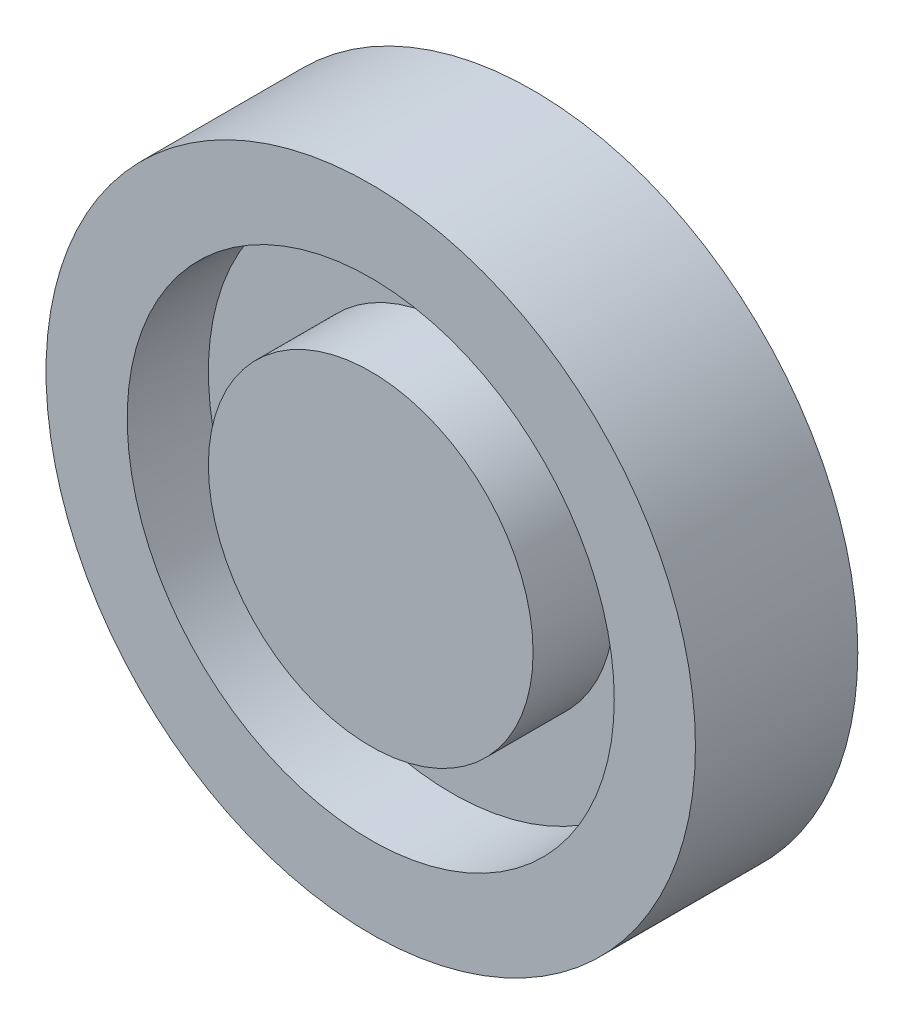
ISO-10303-21;
HEADER;
FILE_DESCRIPTION(('STEP AP214'),'2;1');
FILE_NAME('part.step','',(''),(''),'','','');
FILE_SCHEMA(('AUTOMOTIVE_DESIGN { 1 0 10303 214 1 1 1 1 }'));
ENDSEC;
DATA;
#1=APPLICATION_CONTEXT('core data for automotive mechanical design processes');
#2=APPLICATION_PROTOCOL_DEFINITION('international standard','automotive_design',2000,#1);
#3=PRODUCT_CONTEXT('',#1,'mechanical');
#4=PRODUCT('Part','Part','',(#3));
#5=PRODUCT_RELATED_PRODUCT_CATEGORY('part','',(#4));
#6=PRODUCT_DEFINITION_FORMATION('','',#4);
#7=PRODUCT_DEFINITION_CONTEXT('part definition',#1,'design');
#8=PRODUCT_DEFINITION('design','',#6,#7);
#9=PRODUCT_DEFINITION_SHAPE('','',#8);
#10=(LENGTH_UNIT() NAMED_UNIT(*) SI_UNIT(.MILLI.,.METRE.));
#11=(NAMED_UNIT(*) PLANE_ANGLE_UNIT() SI_UNIT($,.RADIAN.));
#12=(NAMED_UNIT(*) SI_UNIT($,.STERADIAN.) SOLID_ANGLE_UNIT());
#13=UNCERTAINTY_MEASURE_WITH_UNIT(LENGTH_MEASURE(1.E-05),#10,'distance_accuracy_value','');
#14=(GEOMETRIC_REPRESENTATION_CONTEXT(3) GLOBAL_UNCERTAINTY_ASSIGNED_CONTEXT((#13)) GLOBAL_UNIT_ASSIGNED_CONTEXT((#10,
#11,#12)) REPRESENTATION_CONTEXT('',''));
#15=CARTESIAN_POINT('',(0.,0.,0.));
#16=DIRECTION('',(0.,0.,1.));
#17=DIRECTION('',(1.,0.,0.));
#18=AXIS2_PLACEMENT_3D('',#15,#16,#17);
#19=CARTESIAN_POINT('',(0.,0.,1.));
#20=DIRECTION('',(0.,0.,-1.));
#21=DIRECTION('',(-1.,0.,0.));
#22=AXIS2_PLACEMENT_3D('',#19,#20,#21);
#23=CYLINDRICAL_SURFACE('',#22,2.);
#24=CARTESIAN_POINT('',(0.,0.,1.));
#25=DIRECTION('',(0.,0.,1.));
#26=DIRECTION('',(1.,0.,0.));
#27=AXIS2_PLACEMENT_3D('',#24,#25,#26);
#28=CIRCLE('',#27,2.);
#29=CARTESIAN_POINT('',(2.,0.,1.));
#30=VERTEX_POINT('',#29);
#31=EDGE_CURVE('E10',#30,#30,#28,.T.);
#32=ORIENTED_EDGE('',*,*,#31,.F.);
#33=EDGE_LOOP('',(#32));
#34=FACE_BOUND('',#33,.T.);
#35=CARTESIAN_POINT('',(0.,0.,0.));
#36=DIRECTION('',(0.,0.,1.));
#37=DIRECTION('',(1.,0.,0.));
#38=AXIS2_PLACEMENT_3D('',#35,#36,#37);
#39=CIRCLE('',#38,2.);
#40=CARTESIAN_POINT('',(2.,0.,0.));
#41=VERTEX_POINT('',#40);
#42=EDGE_CURVE('E40',#41,#41,#39,.T.);
#43=ORIENTED_EDGE('',*,*,#42,.T.);
#44=EDGE_LOOP('',(#43));
#45=FACE_BOUND('',#44,.T.);
#46=ADVANCED_FACE('F37',(#34,#45),#23,.T.);
#47=CARTESIAN_POINT('',(0.,0.,1.));
#48=DIRECTION('',(0.,0.,1.));
#49=DIRECTION('',(1.,0.,0.));
#50=AXIS2_PLACEMENT_3D('',#47,#48,#49);
#51=PLANE('',#50);
#52=CARTESIAN_POINT('',(0.,0.,1.));
#53=DIRECTION('',(0.,0.,1.));
#54=DIRECTION('',(1.,0.,0.));
#55=AXIS2_PLACEMENT_3D('',#52,#53,#54);
#56=CIRCLE('',#55,1.5);
#57=CARTESIAN_POINT('',(1.5,0.,1.));
#58=VERTEX_POINT('',#57);
#59=EDGE_CURVE('E51',#58,#58,#56,.T.);
#60=ORIENTED_EDGE('',*,*,#59,.F.);
#61=EDGE_LOOP('',(#60));
#62=FACE_BOUND('',#61,.T.);
#63=ORIENTED_EDGE('',*,*,#31,.T.);
#64=EDGE_LOOP('',(#63));
#65=FACE_BOUND('',#64,.T.);
#66=ADVANCED_FACE('F83',(#62,#65),#51,.T.);
#67=CARTESIAN_POINT('',(0.,0.,0.));
#68=DIRECTION('',(0.,0.,1.));
#69=DIRECTION('',(1.,0.,0.));
#70=AXIS2_PLACEMENT_3D('',#67,#68,#69);
#71=PLANE('',#70);
#72=ORIENTED_EDGE('',*,*,#42,.F.);
#73=EDGE_LOOP('',(#72));
#74=FACE_BOUND('',#73,.T.);
#75=ADVANCED_FACE('F79',(#74),#71,.F.);
#76=CARTESIAN_POINT('',(0.,0.,0.5));
#77=DIRECTION('',(0.,0.,1.));
#78=DIRECTION('',(1.,0.,0.));
#79=AXIS2_PLACEMENT_3D('',#76,#77,#78);
#80=CYLINDRICAL_SURFACE('',#79,1.5);
#81=CARTESIAN_POINT('',(0.,0.,0.5));
#82=DIRECTION('',(0.,0.,1.));
#83=DIRECTION('',(1.,0.,0.));
#84=AXIS2_PLACEMENT_3D('',#81,#82,#83);
#85=CIRCLE('',#84,1.5);
#86=CARTESIAN_POINT('',(1.5,0.,0.5));
#87=VERTEX_POINT('',#86);
#88=EDGE_CURVE('E49',#87,#87,#85,.T.);
#89=ORIENTED_EDGE('',*,*,#88,.F.);
#90=EDGE_LOOP('',(#89));
#91=FACE_BOUND('',#90,.T.);
#92=ORIENTED_EDGE('',*,*,#59,.T.);
#93=EDGE_LOOP('',(#92));
#94=FACE_BOUND('',#93,.T.);
#95=ADVANCED_FACE('F73',(#91,#94),#80,.F.);
#96=CARTESIAN_POINT('',(0.,0.,0.5));
#97=DIRECTION('',(0.,0.,1.));
#98=DIRECTION('',(1.,0.,0.));
#99=AXIS2_PLACEMENT_3D('',#96,#97,#98);
#100=PLANE('',#99);
#101=CARTESIAN_POINT('',(0.,0.,0.5));
#102=DIRECTION('',(0.,0.,1.));
#103=DIRECTION('',(1.,0.,0.));
#104=AXIS2_PLACEMENT_3D('',#101,#102,#103);
#105=CIRCLE('',#104,1.);
#106=CARTESIAN_POINT('',(1.,0.,0.5));
#107=VERTEX_POINT('',#106);
#108=EDGE_CURVE('E55',#107,#107,#105,.T.);
#109=ORIENTED_EDGE('',*,*,#108,.F.);
#110=EDGE_LOOP('',(#109));
#111=FACE_BOUND('',#110,.T.);
#112=ORIENTED_EDGE('',*,*,#88,.T.);
#113=EDGE_LOOP('',(#112));
#114=FACE_BOUND('',#113,.T.);
#115=ADVANCED_FACE('F70',(#111,#114),#100,.T.);
#116=CARTESIAN_POINT('',(0.,0.,0.5));
#117=DIRECTION('',(0.,0.,1.));
#118=DIRECTION('',(1.,0.,0.));
#119=AXIS2_PLACEMENT_3D('',#116,#117,#118);
#120=CYLINDRICAL_SURFACE('',#119,1.);
#121=ORIENTED_EDGE('',*,*,#108,.T.);
#122=EDGE_LOOP('',(#121));
#123=FACE_BOUND('',#122,.T.);
#124=CARTESIAN_POINT('',(0.,0.,1.));
#125=DIRECTION('',(0.,0.,1.));
#126=DIRECTION('',(1.,0.,0.));
#127=AXIS2_PLACEMENT_3D('',#124,#125,#126);
#128=CIRCLE('',#127,1.);
#129=CARTESIAN_POINT('',(1.,0.,1.));
#130=VERTEX_POINT('',#129);
#131=EDGE_CURVE('E59',#130,#130,#128,.T.);
#132=ORIENTED_EDGE('',*,*,#131,.F.);
#133=EDGE_LOOP('',(#132));
#134=FACE_BOUND('',#133,.T.);
#135=ADVANCED_FACE('F67',(#123,#134),#120,.T.);
#136=ORIENTED_EDGE('',*,*,#131,.T.);
#137=EDGE_LOOP('',(#136));
#138=FACE_BOUND('',#137,.T.);
#139=ADVANCED_FACE('F86',(#138),#51,.T.);
#140=CLOSED_SHELL('',(#46,#66,#75,#95,#115,#135,#139));
#141=MANIFOLD_SOLID_BREP('B2',#140);
#142=ADVANCED_BREP_SHAPE_REPRESENTATION('',(#18,#141),#14);
#143=SHAPE_DEFINITION_REPRESENTATION(#9,#142);
ENDSEC;
END-ISO-10303-21;
